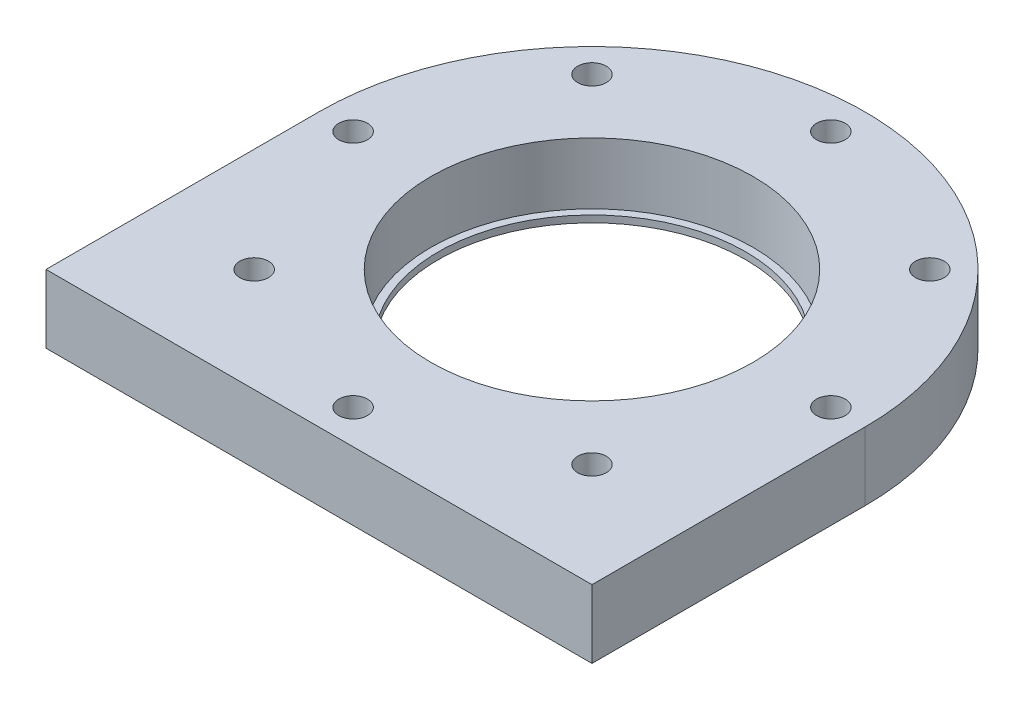
ISO-10303-21;
HEADER;
FILE_DESCRIPTION(('STEP AP214'),'2;1');
FILE_NAME('part.step','',(''),(''),'','','');
FILE_SCHEMA(('AUTOMOTIVE_DESIGN { 1 0 10303 214 1 1 1 1 }'));
ENDSEC;
DATA;
#1=APPLICATION_CONTEXT('core data for automotive mechanical design processes');
#2=APPLICATION_PROTOCOL_DEFINITION('international standard','automotive_design',2000,#1);
#3=PRODUCT_CONTEXT('',#1,'mechanical');
#4=PRODUCT('Part','Part','',(#3));
#5=PRODUCT_RELATED_PRODUCT_CATEGORY('part','',(#4));
#6=PRODUCT_DEFINITION_FORMATION('','',#4);
#7=PRODUCT_DEFINITION_CONTEXT('part definition',#1,'design');
#8=PRODUCT_DEFINITION('design','',#6,#7);
#9=PRODUCT_DEFINITION_SHAPE('','',#8);
#10=(LENGTH_UNIT() NAMED_UNIT(*) SI_UNIT(.MILLI.,.METRE.));
#11=(NAMED_UNIT(*) PLANE_ANGLE_UNIT() SI_UNIT($,.RADIAN.));
#12=(NAMED_UNIT(*) SI_UNIT($,.STERADIAN.) SOLID_ANGLE_UNIT());
#13=UNCERTAINTY_MEASURE_WITH_UNIT(LENGTH_MEASURE(1.E-05),#10,'distance_accuracy_value','');
#14=(GEOMETRIC_REPRESENTATION_CONTEXT(3) GLOBAL_UNCERTAINTY_ASSIGNED_CONTEXT((#13)) GLOBAL_UNIT_ASSIGNED_CONTEXT((#10,
#11,#12)) REPRESENTATION_CONTEXT('',''));
#15=CARTESIAN_POINT('',(0.,0.,0.));
#16=DIRECTION('',(0.,0.,1.));
#17=DIRECTION('',(1.,0.,0.));
#18=AXIS2_PLACEMENT_3D('',#15,#16,#17);
#19=CARTESIAN_POINT('',(0.,10.,0.));
#20=DIRECTION('',(0.,-1.,0.));
#21=DIRECTION('',(0.,0.,-1.));
#22=AXIS2_PLACEMENT_3D('',#19,#20,#21);
#23=CYLINDRICAL_SURFACE('',#22,22.5);
#24=CARTESIAN_POINT('',(0.,0.,0.));
#25=DIRECTION('',(0.,1.,0.));
#26=DIRECTION('',(0.,0.,1.));
#27=AXIS2_PLACEMENT_3D('',#24,#25,#26);
#28=CIRCLE('',#27,22.5);
#29=CARTESIAN_POINT('',(0.,0.,22.5));
#30=VERTEX_POINT('',#29);
#31=EDGE_CURVE('E118',#30,#30,#28,.T.);
#32=ORIENTED_EDGE('',*,*,#31,.F.);
#33=EDGE_LOOP('',(#32));
#34=FACE_BOUND('',#33,.T.);
#35=CARTESIAN_POINT('',(0.,1.,0.));
#36=DIRECTION('',(0.,1.,0.));
#37=DIRECTION('',(0.,0.,1.));
#38=AXIS2_PLACEMENT_3D('',#35,#36,#37);
#39=CIRCLE('',#38,22.5);
#40=CARTESIAN_POINT('',(0.,1.,22.5));
#41=VERTEX_POINT('',#40);
#42=EDGE_CURVE('E47',#41,#41,#39,.T.);
#43=ORIENTED_EDGE('',*,*,#42,.T.);
#44=EDGE_LOOP('',(#43));
#45=FACE_BOUND('',#44,.T.);
#46=ADVANCED_FACE('F43',(#34,#45),#23,.F.);
#47=CARTESIAN_POINT('',(0.,10.,0.));
#48=DIRECTION('',(0.,1.,0.));
#49=DIRECTION('',(0.,0.,1.));
#50=AXIS2_PLACEMENT_3D('',#47,#48,#49);
#51=PLANE('',#50);
#52=CARTESIAN_POINT('',(0.,10.,0.));
#53=DIRECTION('',(0.,1.,0.));
#54=DIRECTION('',(0.,0.,1.));
#55=AXIS2_PLACEMENT_3D('',#52,#53,#54);
#56=CIRCLE('',#55,23.6);
#57=CARTESIAN_POINT('',(0.,10.,23.6));
#58=VERTEX_POINT('',#57);
#59=EDGE_CURVE('E203',#58,#58,#56,.T.);
#60=ORIENTED_EDGE('',*,*,#59,.F.);
#61=EDGE_LOOP('',(#60));
#62=FACE_BOUND('',#61,.T.);
#63=CARTESIAN_POINT('',(0.,10.,-35.));
#64=DIRECTION('',(0.,1.,0.));
#65=DIRECTION('',(0.,0.,1.));
#66=AXIS2_PLACEMENT_3D('',#63,#64,#65);
#67=CIRCLE('',#66,2.1);
#68=CARTESIAN_POINT('',(0.,10.,-32.9));
#69=VERTEX_POINT('',#68);
#70=EDGE_CURVE('E196',#69,#69,#67,.T.);
#71=ORIENTED_EDGE('',*,*,#70,.F.);
#72=EDGE_LOOP('',(#71));
#73=FACE_BOUND('',#72,.T.);
#74=CARTESIAN_POINT('',(24.7487373415292,10.,-24.7487373415292));
#75=DIRECTION('',(0.,1.,0.));
#76=DIRECTION('',(0.,0.,1.));
#77=AXIS2_PLACEMENT_3D('',#74,#75,#76);
#78=CIRCLE('',#77,2.1);
#79=CARTESIAN_POINT('',(24.7487373415292,10.,-22.6487373415292));
#80=VERTEX_POINT('',#79);
#81=EDGE_CURVE('E192',#80,#80,#78,.T.);
#82=ORIENTED_EDGE('',*,*,#81,.F.);
#83=EDGE_LOOP('',(#82));
#84=FACE_BOUND('',#83,.T.);
#85=CARTESIAN_POINT('',(35.,10.,0.));
#86=DIRECTION('',(0.,1.,0.));
#87=DIRECTION('',(0.,0.,1.));
#88=AXIS2_PLACEMENT_3D('',#85,#86,#87);
#89=CIRCLE('',#88,2.1);
#90=CARTESIAN_POINT('',(35.,10.,2.1));
#91=VERTEX_POINT('',#90);
#92=EDGE_CURVE('E184',#91,#91,#89,.T.);
#93=ORIENTED_EDGE('',*,*,#92,.F.);
#94=EDGE_LOOP('',(#93));
#95=FACE_BOUND('',#94,.T.);
#96=CARTESIAN_POINT('',(24.7487373415292,10.,24.7487373415292));
#97=DIRECTION('',(0.,1.,0.));
#98=DIRECTION('',(0.,0.,1.));
#99=AXIS2_PLACEMENT_3D('',#96,#97,#98);
#100=CIRCLE('',#99,2.1);
#101=CARTESIAN_POINT('',(24.7487373415292,10.,26.8487373415292));
#102=VERTEX_POINT('',#101);
#103=EDGE_CURVE('E176',#102,#102,#100,.T.);
#104=ORIENTED_EDGE('',*,*,#103,.F.);
#105=EDGE_LOOP('',(#104));
#106=FACE_BOUND('',#105,.T.);
#107=CARTESIAN_POINT('',(0.,10.,35.));
#108=DIRECTION('',(0.,1.,0.));
#109=DIRECTION('',(0.,0.,1.));
#110=AXIS2_PLACEMENT_3D('',#107,#108,#109);
#111=CIRCLE('',#110,2.1);
#112=CARTESIAN_POINT('',(0.,10.,37.1));
#113=VERTEX_POINT('',#112);
#114=EDGE_CURVE('E168',#113,#113,#111,.T.);
#115=ORIENTED_EDGE('',*,*,#114,.F.);
#116=EDGE_LOOP('',(#115));
#117=FACE_BOUND('',#116,.T.);
#118=CARTESIAN_POINT('',(-24.7487373415292,10.,24.7487373415292));
#119=DIRECTION('',(0.,1.,0.));
#120=DIRECTION('',(0.,0.,1.));
#121=AXIS2_PLACEMENT_3D('',#118,#119,#120);
#122=CIRCLE('',#121,2.1);
#123=CARTESIAN_POINT('',(-24.7487373415292,10.,26.8487373415292));
#124=VERTEX_POINT('',#123);
#125=EDGE_CURVE('E160',#124,#124,#122,.T.);
#126=ORIENTED_EDGE('',*,*,#125,.F.);
#127=EDGE_LOOP('',(#126));
#128=FACE_BOUND('',#127,.T.);
#129=CARTESIAN_POINT('',(-35.,10.,0.));
#130=DIRECTION('',(0.,1.,0.));
#131=DIRECTION('',(0.,0.,1.));
#132=AXIS2_PLACEMENT_3D('',#129,#130,#131);
#133=CIRCLE('',#132,2.1);
#134=CARTESIAN_POINT('',(-35.,10.,2.1));
#135=VERTEX_POINT('',#134);
#136=EDGE_CURVE('E152',#135,#135,#133,.T.);
#137=ORIENTED_EDGE('',*,*,#136,.F.);
#138=EDGE_LOOP('',(#137));
#139=FACE_BOUND('',#138,.T.);
#140=CARTESIAN_POINT('',(-24.7487373415292,10.,-24.7487373415292));
#141=DIRECTION('',(0.,1.,0.));
#142=DIRECTION('',(0.,0.,1.));
#143=AXIS2_PLACEMENT_3D('',#140,#141,#142);
#144=CIRCLE('',#143,2.1);
#145=CARTESIAN_POINT('',(-24.7487373415292,10.,-22.6487373415292));
#146=VERTEX_POINT('',#145);
#147=EDGE_CURVE('E144',#146,#146,#144,.T.);
#148=ORIENTED_EDGE('',*,*,#147,.F.);
#149=EDGE_LOOP('',(#148));
#150=FACE_BOUND('',#149,.T.);
#151=CARTESIAN_POINT('',(0.,10.,0.));
#152=DIRECTION('',(0.,1.,0.));
#153=DIRECTION('',(0.,0.,1.));
#154=AXIS2_PLACEMENT_3D('',#151,#152,#153);
#155=CIRCLE('',#154,40.);
#156=CARTESIAN_POINT('',(40.,10.,0.));
#157=VERTEX_POINT('',#156);
#158=CARTESIAN_POINT('',(-40.,10.,0.));
#159=VERTEX_POINT('',#158);
#160=EDGE_CURVE('E97',#157,#159,#155,.T.);
#161=ORIENTED_EDGE('',*,*,#160,.T.);
#162=DIRECTION('',(0.,0.,1.));
#163=VECTOR('',#162,1.);
#164=CARTESIAN_POINT('',(-40.,10.,0.));
#165=LINE('',#164,#163);
#166=CARTESIAN_POINT('',(-40.,10.,40.));
#167=VERTEX_POINT('',#166);
#168=EDGE_CURVE('E92',#159,#167,#165,.T.);
#169=ORIENTED_EDGE('',*,*,#168,.T.);
#170=DIRECTION('',(1.,0.,0.));
#171=VECTOR('',#170,1.);
#172=CARTESIAN_POINT('',(-40.,10.,40.));
#173=LINE('',#172,#171);
#174=CARTESIAN_POINT('',(40.,10.,40.));
#175=VERTEX_POINT('',#174);
#176=EDGE_CURVE('E95',#167,#175,#173,.T.);
#177=ORIENTED_EDGE('',*,*,#176,.T.);
#178=DIRECTION('',(0.,0.,-1.));
#179=VECTOR('',#178,1.);
#180=CARTESIAN_POINT('',(40.,10.,0.));
#181=LINE('',#180,#179);
#182=EDGE_CURVE('E62',#175,#157,#181,.T.);
#183=ORIENTED_EDGE('',*,*,#182,.T.);
#184=EDGE_LOOP('',(#161,#169,#177,#183));
#185=FACE_BOUND('',#184,.T.);
#186=ADVANCED_FACE('F93',(#62,#73,#84,#95,#106,#117,#128,#139,#150,#185),#51,.T.);
#187=CARTESIAN_POINT('',(0.,0.,0.));
#188=DIRECTION('',(0.,1.,0.));
#189=DIRECTION('',(0.,0.,1.));
#190=AXIS2_PLACEMENT_3D('',#187,#188,#189);
#191=PLANE('',#190);
#192=CARTESIAN_POINT('',(0.,0.,-35.));
#193=DIRECTION('',(0.,1.,0.));
#194=DIRECTION('',(0.,0.,1.));
#195=AXIS2_PLACEMENT_3D('',#192,#193,#194);
#196=CIRCLE('',#195,2.1);
#197=CARTESIAN_POINT('',(0.,0.,-32.9));
#198=VERTEX_POINT('',#197);
#199=EDGE_CURVE('E139',#198,#198,#196,.T.);
#200=ORIENTED_EDGE('',*,*,#199,.T.);
#201=EDGE_LOOP('',(#200));
#202=FACE_BOUND('',#201,.T.);
#203=CARTESIAN_POINT('',(24.7487373415292,0.,-24.7487373415292));
#204=DIRECTION('',(0.,1.,0.));
#205=DIRECTION('',(0.,0.,1.));
#206=AXIS2_PLACEMENT_3D('',#203,#204,#205);
#207=CIRCLE('',#206,2.1);
#208=CARTESIAN_POINT('',(24.7487373415292,0.,-22.6487373415292));
#209=VERTEX_POINT('',#208);
#210=EDGE_CURVE('E188',#209,#209,#207,.T.);
#211=ORIENTED_EDGE('',*,*,#210,.T.);
#212=EDGE_LOOP('',(#211));
#213=FACE_BOUND('',#212,.T.);
#214=CARTESIAN_POINT('',(35.,0.,0.));
#215=DIRECTION('',(0.,1.,0.));
#216=DIRECTION('',(0.,0.,1.));
#217=AXIS2_PLACEMENT_3D('',#214,#215,#216);
#218=CIRCLE('',#217,2.1);
#219=CARTESIAN_POINT('',(35.,0.,2.1));
#220=VERTEX_POINT('',#219);
#221=EDGE_CURVE('E180',#220,#220,#218,.T.);
#222=ORIENTED_EDGE('',*,*,#221,.T.);
#223=EDGE_LOOP('',(#222));
#224=FACE_BOUND('',#223,.T.);
#225=CARTESIAN_POINT('',(24.7487373415292,0.,24.7487373415292));
#226=DIRECTION('',(0.,1.,0.));
#227=DIRECTION('',(0.,0.,1.));
#228=AXIS2_PLACEMENT_3D('',#225,#226,#227);
#229=CIRCLE('',#228,2.1);
#230=CARTESIAN_POINT('',(24.7487373415292,0.,26.8487373415292));
#231=VERTEX_POINT('',#230);
#232=EDGE_CURVE('E172',#231,#231,#229,.T.);
#233=ORIENTED_EDGE('',*,*,#232,.T.);
#234=EDGE_LOOP('',(#233));
#235=FACE_BOUND('',#234,.T.);
#236=CARTESIAN_POINT('',(0.,0.,35.));
#237=DIRECTION('',(0.,1.,0.));
#238=DIRECTION('',(0.,0.,1.));
#239=AXIS2_PLACEMENT_3D('',#236,#237,#238);
#240=CIRCLE('',#239,2.1);
#241=CARTESIAN_POINT('',(0.,0.,37.1));
#242=VERTEX_POINT('',#241);
#243=EDGE_CURVE('E164',#242,#242,#240,.T.);
#244=ORIENTED_EDGE('',*,*,#243,.T.);
#245=EDGE_LOOP('',(#244));
#246=FACE_BOUND('',#245,.T.);
#247=CARTESIAN_POINT('',(-24.7487373415292,0.,24.7487373415292));
#248=DIRECTION('',(0.,1.,0.));
#249=DIRECTION('',(0.,0.,1.));
#250=AXIS2_PLACEMENT_3D('',#247,#248,#249);
#251=CIRCLE('',#250,2.1);
#252=CARTESIAN_POINT('',(-24.7487373415292,0.,26.8487373415292));
#253=VERTEX_POINT('',#252);
#254=EDGE_CURVE('E156',#253,#253,#251,.T.);
#255=ORIENTED_EDGE('',*,*,#254,.T.);
#256=EDGE_LOOP('',(#255));
#257=FACE_BOUND('',#256,.T.);
#258=CARTESIAN_POINT('',(-35.,0.,0.));
#259=DIRECTION('',(0.,1.,0.));
#260=DIRECTION('',(0.,0.,1.));
#261=AXIS2_PLACEMENT_3D('',#258,#259,#260);
#262=CIRCLE('',#261,2.1);
#263=CARTESIAN_POINT('',(-35.,0.,2.1));
#264=VERTEX_POINT('',#263);
#265=EDGE_CURVE('E148',#264,#264,#262,.T.);
#266=ORIENTED_EDGE('',*,*,#265,.T.);
#267=EDGE_LOOP('',(#266));
#268=FACE_BOUND('',#267,.T.);
#269=CARTESIAN_POINT('',(-24.7487373415292,0.,-24.7487373415292));
#270=DIRECTION('',(0.,1.,0.));
#271=DIRECTION('',(0.,0.,1.));
#272=AXIS2_PLACEMENT_3D('',#269,#270,#271);
#273=CIRCLE('',#272,2.1);
#274=CARTESIAN_POINT('',(-24.7487373415292,0.,-22.6487373415292));
#275=VERTEX_POINT('',#274);
#276=EDGE_CURVE('E140',#275,#275,#273,.T.);
#277=ORIENTED_EDGE('',*,*,#276,.T.);
#278=EDGE_LOOP('',(#277));
#279=FACE_BOUND('',#278,.T.);
#280=CARTESIAN_POINT('',(0.,0.,0.));
#281=DIRECTION('',(0.,1.,0.));
#282=DIRECTION('',(0.,0.,1.));
#283=AXIS2_PLACEMENT_3D('',#280,#281,#282);
#284=CIRCLE('',#283,40.);
#285=CARTESIAN_POINT('',(40.,0.,0.));
#286=VERTEX_POINT('',#285);
#287=CARTESIAN_POINT('',(-40.,0.,0.));
#288=VERTEX_POINT('',#287);
#289=EDGE_CURVE('E114',#286,#288,#284,.T.);
#290=ORIENTED_EDGE('',*,*,#289,.F.);
#291=DIRECTION('',(0.,0.,-1.));
#292=VECTOR('',#291,1.);
#293=CARTESIAN_POINT('',(40.,0.,0.));
#294=LINE('',#293,#292);
#295=CARTESIAN_POINT('',(40.,0.,40.));
#296=VERTEX_POINT('',#295);
#297=EDGE_CURVE('E85',#296,#286,#294,.T.);
#298=ORIENTED_EDGE('',*,*,#297,.F.);
#299=DIRECTION('',(1.,0.,0.));
#300=VECTOR('',#299,1.);
#301=CARTESIAN_POINT('',(-40.,0.,40.));
#302=LINE('',#301,#300);
#303=CARTESIAN_POINT('',(-40.,0.,40.));
#304=VERTEX_POINT('',#303);
#305=EDGE_CURVE('E79',#304,#296,#302,.T.);
#306=ORIENTED_EDGE('',*,*,#305,.F.);
#307=DIRECTION('',(0.,0.,1.));
#308=VECTOR('',#307,1.);
#309=CARTESIAN_POINT('',(-40.,0.,0.));
#310=LINE('',#309,#308);
#311=EDGE_CURVE('E102',#288,#304,#310,.T.);
#312=ORIENTED_EDGE('',*,*,#311,.F.);
#313=EDGE_LOOP('',(#290,#298,#306,#312));
#314=FACE_BOUND('',#313,.T.);
#315=ORIENTED_EDGE('',*,*,#31,.T.);
#316=EDGE_LOOP('',(#315));
#317=FACE_BOUND('',#316,.T.);
#318=ADVANCED_FACE('F131',(#202,#213,#224,#235,#246,#257,#268,#279,#314,#317),#191,.F.);
#319=CARTESIAN_POINT('',(0.,10.,0.));
#320=DIRECTION('',(0.,-1.,0.));
#321=DIRECTION('',(0.,0.,-1.));
#322=AXIS2_PLACEMENT_3D('',#319,#320,#321);
#323=CYLINDRICAL_SURFACE('',#322,40.);
#324=ORIENTED_EDGE('',*,*,#289,.T.);
#325=DIRECTION('',(0.,-1.,0.));
#326=VECTOR('',#325,1.);
#327=CARTESIAN_POINT('',(-40.,10.,0.));
#328=LINE('',#327,#326);
#329=EDGE_CURVE('E11',#159,#288,#328,.T.);
#330=ORIENTED_EDGE('',*,*,#329,.F.);
#331=ORIENTED_EDGE('',*,*,#160,.F.);
#332=DIRECTION('',(0.,-1.,0.));
#333=VECTOR('',#332,1.);
#334=CARTESIAN_POINT('',(40.,10.,0.));
#335=LINE('',#334,#333);
#336=EDGE_CURVE('E110',#157,#286,#335,.T.);
#337=ORIENTED_EDGE('',*,*,#336,.T.);
#338=EDGE_LOOP('',(#324,#330,#331,#337));
#339=FACE_BOUND('',#338,.T.);
#340=ADVANCED_FACE('F45',(#339),#323,.T.);
#341=CARTESIAN_POINT('',(-40.,10.,0.));
#342=DIRECTION('',(1.,0.,0.));
#343=DIRECTION('',(0.,0.,-1.));
#344=AXIS2_PLACEMENT_3D('',#341,#342,#343);
#345=PLANE('',#344);
#346=ORIENTED_EDGE('',*,*,#311,.T.);
#347=DIRECTION('',(0.,-1.,0.));
#348=VECTOR('',#347,1.);
#349=CARTESIAN_POINT('',(-40.,10.,40.));
#350=LINE('',#349,#348);
#351=EDGE_CURVE('E54',#167,#304,#350,.T.);
#352=ORIENTED_EDGE('',*,*,#351,.F.);
#353=ORIENTED_EDGE('',*,*,#168,.F.);
#354=ORIENTED_EDGE('',*,*,#329,.T.);
#355=EDGE_LOOP('',(#346,#352,#353,#354));
#356=FACE_BOUND('',#355,.T.);
#357=ADVANCED_FACE('F101',(#356),#345,.F.);
#358=CARTESIAN_POINT('',(-40.,10.,40.));
#359=DIRECTION('',(0.,0.,-1.));
#360=DIRECTION('',(-1.,0.,0.));
#361=AXIS2_PLACEMENT_3D('',#358,#359,#360);
#362=PLANE('',#361);
#363=ORIENTED_EDGE('',*,*,#305,.T.);
#364=DIRECTION('',(0.,-1.,0.));
#365=VECTOR('',#364,1.);
#366=CARTESIAN_POINT('',(40.,10.,40.));
#367=LINE('',#366,#365);
#368=EDGE_CURVE('E104',#175,#296,#367,.T.);
#369=ORIENTED_EDGE('',*,*,#368,.F.);
#370=ORIENTED_EDGE('',*,*,#176,.F.);
#371=ORIENTED_EDGE('',*,*,#351,.T.);
#372=EDGE_LOOP('',(#363,#369,#370,#371));
#373=FACE_BOUND('',#372,.T.);
#374=ADVANCED_FACE('F106',(#373),#362,.F.);
#375=CARTESIAN_POINT('',(40.,10.,0.));
#376=DIRECTION('',(-1.,0.,0.));
#377=DIRECTION('',(0.,0.,1.));
#378=AXIS2_PLACEMENT_3D('',#375,#376,#377);
#379=PLANE('',#378);
#380=ORIENTED_EDGE('',*,*,#297,.T.);
#381=ORIENTED_EDGE('',*,*,#336,.F.);
#382=ORIENTED_EDGE('',*,*,#182,.F.);
#383=ORIENTED_EDGE('',*,*,#368,.T.);
#384=EDGE_LOOP('',(#380,#381,#382,#383));
#385=FACE_BOUND('',#384,.T.);
#386=ADVANCED_FACE('F128',(#385),#379,.F.);
#387=CARTESIAN_POINT('',(-24.7487373415292,0.,-24.7487373415292));
#388=DIRECTION('',(0.,1.,0.));
#389=DIRECTION('',(0.,0.,1.));
#390=AXIS2_PLACEMENT_3D('',#387,#388,#389);
#391=CYLINDRICAL_SURFACE('',#390,2.1);
#392=ORIENTED_EDGE('',*,*,#276,.F.);
#393=EDGE_LOOP('',(#392));
#394=FACE_BOUND('',#393,.T.);
#395=ORIENTED_EDGE('',*,*,#147,.T.);
#396=EDGE_LOOP('',(#395));
#397=FACE_BOUND('',#396,.T.);
#398=ADVANCED_FACE('F237',(#394,#397),#391,.F.);
#399=CARTESIAN_POINT('',(-35.,0.,0.));
#400=DIRECTION('',(0.,1.,0.));
#401=DIRECTION('',(0.,0.,1.));
#402=AXIS2_PLACEMENT_3D('',#399,#400,#401);
#403=CYLINDRICAL_SURFACE('',#402,2.1);
#404=ORIENTED_EDGE('',*,*,#265,.F.);
#405=EDGE_LOOP('',(#404));
#406=FACE_BOUND('',#405,.T.);
#407=ORIENTED_EDGE('',*,*,#136,.T.);
#408=EDGE_LOOP('',(#407));
#409=FACE_BOUND('',#408,.T.);
#410=ADVANCED_FACE('F342',(#406,#409),#403,.F.);
#411=CARTESIAN_POINT('',(-24.7487373415292,0.,24.7487373415292));
#412=DIRECTION('',(0.,1.,0.));
#413=DIRECTION('',(0.,0.,1.));
#414=AXIS2_PLACEMENT_3D('',#411,#412,#413);
#415=CYLINDRICAL_SURFACE('',#414,2.1);
#416=ORIENTED_EDGE('',*,*,#254,.F.);
#417=EDGE_LOOP('',(#416));
#418=FACE_BOUND('',#417,.T.);
#419=ORIENTED_EDGE('',*,*,#125,.T.);
#420=EDGE_LOOP('',(#419));
#421=FACE_BOUND('',#420,.T.);
#422=ADVANCED_FACE('F332',(#418,#421),#415,.F.);
#423=CARTESIAN_POINT('',(0.,0.,35.));
#424=DIRECTION('',(0.,1.,0.));
#425=DIRECTION('',(0.,0.,1.));
#426=AXIS2_PLACEMENT_3D('',#423,#424,#425);
#427=CYLINDRICAL_SURFACE('',#426,2.1);
#428=ORIENTED_EDGE('',*,*,#243,.F.);
#429=EDGE_LOOP('',(#428));
#430=FACE_BOUND('',#429,.T.);
#431=ORIENTED_EDGE('',*,*,#114,.T.);
#432=EDGE_LOOP('',(#431));
#433=FACE_BOUND('',#432,.T.);
#434=ADVANCED_FACE('F322',(#430,#433),#427,.F.);
#435=CARTESIAN_POINT('',(24.7487373415292,0.,24.7487373415292));
#436=DIRECTION('',(0.,1.,0.));
#437=DIRECTION('',(0.,0.,1.));
#438=AXIS2_PLACEMENT_3D('',#435,#436,#437);
#439=CYLINDRICAL_SURFACE('',#438,2.1);
#440=ORIENTED_EDGE('',*,*,#232,.F.);
#441=EDGE_LOOP('',(#440));
#442=FACE_BOUND('',#441,.T.);
#443=ORIENTED_EDGE('',*,*,#103,.T.);
#444=EDGE_LOOP('',(#443));
#445=FACE_BOUND('',#444,.T.);
#446=ADVANCED_FACE('F312',(#442,#445),#439,.F.);
#447=CARTESIAN_POINT('',(35.,0.,0.));
#448=DIRECTION('',(0.,1.,0.));
#449=DIRECTION('',(0.,0.,1.));
#450=AXIS2_PLACEMENT_3D('',#447,#448,#449);
#451=CYLINDRICAL_SURFACE('',#450,2.1);
#452=ORIENTED_EDGE('',*,*,#221,.F.);
#453=EDGE_LOOP('',(#452));
#454=FACE_BOUND('',#453,.T.);
#455=ORIENTED_EDGE('',*,*,#92,.T.);
#456=EDGE_LOOP('',(#455));
#457=FACE_BOUND('',#456,.T.);
#458=ADVANCED_FACE('F302',(#454,#457),#451,.F.);
#459=CARTESIAN_POINT('',(24.7487373415292,0.,-24.7487373415292));
#460=DIRECTION('',(0.,1.,0.));
#461=DIRECTION('',(0.,0.,1.));
#462=AXIS2_PLACEMENT_3D('',#459,#460,#461);
#463=CYLINDRICAL_SURFACE('',#462,2.1);
#464=ORIENTED_EDGE('',*,*,#210,.F.);
#465=EDGE_LOOP('',(#464));
#466=FACE_BOUND('',#465,.T.);
#467=ORIENTED_EDGE('',*,*,#81,.T.);
#468=EDGE_LOOP('',(#467));
#469=FACE_BOUND('',#468,.T.);
#470=ADVANCED_FACE('F293',(#466,#469),#463,.F.);
#471=CARTESIAN_POINT('',(0.,0.,-35.));
#472=DIRECTION('',(0.,1.,0.));
#473=DIRECTION('',(0.,0.,1.));
#474=AXIS2_PLACEMENT_3D('',#471,#472,#473);
#475=CYLINDRICAL_SURFACE('',#474,2.1);
#476=ORIENTED_EDGE('',*,*,#199,.F.);
#477=EDGE_LOOP('',(#476));
#478=FACE_BOUND('',#477,.T.);
#479=ORIENTED_EDGE('',*,*,#70,.T.);
#480=EDGE_LOOP('',(#479));
#481=FACE_BOUND('',#480,.T.);
#482=ADVANCED_FACE('F224',(#478,#481),#475,.F.);
#483=CARTESIAN_POINT('',(0.,1.,0.));
#484=DIRECTION('',(0.,1.,0.));
#485=DIRECTION('',(0.,0.,1.));
#486=AXIS2_PLACEMENT_3D('',#483,#484,#485);
#487=CYLINDRICAL_SURFACE('',#486,23.6);
#488=CARTESIAN_POINT('',(0.,1.,0.));
#489=DIRECTION('',(0.,1.,0.));
#490=DIRECTION('',(0.,0.,1.));
#491=AXIS2_PLACEMENT_3D('',#488,#489,#490);
#492=CIRCLE('',#491,23.6);
#493=CARTESIAN_POINT('',(0.,1.,23.6));
#494=VERTEX_POINT('',#493);
#495=EDGE_CURVE('E207',#494,#494,#492,.T.);
#496=ORIENTED_EDGE('',*,*,#495,.F.);
#497=EDGE_LOOP('',(#496));
#498=FACE_BOUND('',#497,.T.);
#499=ORIENTED_EDGE('',*,*,#59,.T.);
#500=EDGE_LOOP('',(#499));
#501=FACE_BOUND('',#500,.T.);
#502=ADVANCED_FACE('F219',(#498,#501),#487,.F.);
#503=CARTESIAN_POINT('',(0.,1.,0.));
#504=DIRECTION('',(0.,1.,0.));
#505=DIRECTION('',(0.,0.,1.));
#506=AXIS2_PLACEMENT_3D('',#503,#504,#505);
#507=PLANE('',#506);
#508=ORIENTED_EDGE('',*,*,#42,.F.);
#509=EDGE_LOOP('',(#508));
#510=FACE_BOUND('',#509,.T.);
#511=ORIENTED_EDGE('',*,*,#495,.T.);
#512=EDGE_LOOP('',(#511));
#513=FACE_BOUND('',#512,.T.);
#514=ADVANCED_FACE('F217',(#510,#513),#507,.T.);
#515=CLOSED_SHELL('',(#46,#186,#318,#340,#357,#374,#386,#398,#410,#422,#434,#446,#458,#470,#482,
#502,#514));
#516=MANIFOLD_SOLID_BREP('B2',#515);
#517=ADVANCED_BREP_SHAPE_REPRESENTATION('',(#18,#516),#14);
#518=SHAPE_DEFINITION_REPRESENTATION(#9,#517);
ENDSEC;
END-ISO-10303-21;
